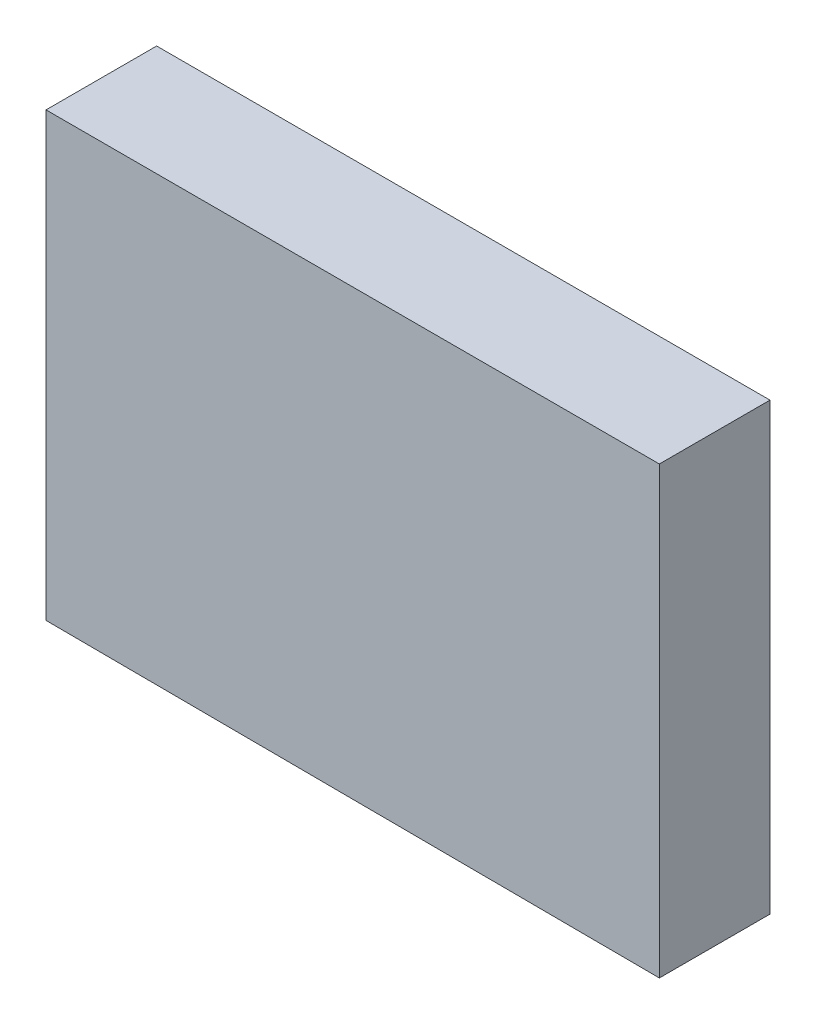
ISO-10303-21;
HEADER;
FILE_DESCRIPTION(('STEP AP214'),'2;1');
FILE_NAME('part.step','',(''),(''),'','','');
FILE_SCHEMA(('AUTOMOTIVE_DESIGN { 1 0 10303 214 1 1 1 1 }'));
ENDSEC;
DATA;
#1=APPLICATION_CONTEXT('core data for automotive mechanical design processes');
#2=APPLICATION_PROTOCOL_DEFINITION('international standard','automotive_design',2000,#1);
#3=PRODUCT_CONTEXT('',#1,'mechanical');
#4=PRODUCT('Part','Part','',(#3));
#5=PRODUCT_RELATED_PRODUCT_CATEGORY('part','',(#4));
#6=PRODUCT_DEFINITION_FORMATION('','',#4);
#7=PRODUCT_DEFINITION_CONTEXT('part definition',#1,'design');
#8=PRODUCT_DEFINITION('design','',#6,#7);
#9=PRODUCT_DEFINITION_SHAPE('','',#8);
#10=(LENGTH_UNIT() NAMED_UNIT(*) SI_UNIT(.MILLI.,.METRE.));
#11=(NAMED_UNIT(*) PLANE_ANGLE_UNIT() SI_UNIT($,.RADIAN.));
#12=(NAMED_UNIT(*) SI_UNIT($,.STERADIAN.) SOLID_ANGLE_UNIT());
#13=UNCERTAINTY_MEASURE_WITH_UNIT(LENGTH_MEASURE(1.E-05),#10,'distance_accuracy_value','');
#14=(GEOMETRIC_REPRESENTATION_CONTEXT(3) GLOBAL_UNCERTAINTY_ASSIGNED_CONTEXT((#13)) GLOBAL_UNIT_ASSIGNED_CONTEXT((#10,
#11,#12)) REPRESENTATION_CONTEXT('',''));
#15=CARTESIAN_POINT('',(0.,0.,0.));
#16=DIRECTION('',(0.,0.,1.));
#17=DIRECTION('',(1.,0.,0.));
#18=AXIS2_PLACEMENT_3D('',#15,#16,#17);
#19=CARTESIAN_POINT('',(3.32677262,-2.41461036,1.20000014));
#20=DIRECTION('',(0.,0.,-1.));
#21=DIRECTION('',(-1.,0.,0.));
#22=AXIS2_PLACEMENT_3D('',#19,#20,#21);
#23=PLANE('',#22);
#24=DIRECTION('',(1.,0.,0.));
#25=VECTOR('',#24,1.);
#26=CARTESIAN_POINT('',(3.32677262,2.4146129,1.20000014));
#27=LINE('',#26,#25);
#28=CARTESIAN_POINT('',(3.32677262,2.4146129,1.20000014));
#29=VERTEX_POINT('',#28);
#30=CARTESIAN_POINT('',(-3.32677008,2.4146129,1.20000014));
#31=VERTEX_POINT('',#30);
#32=EDGE_CURVE('E55',#29,#31,#27,.F.);
#33=ORIENTED_EDGE('',*,*,#32,.T.);
#34=DIRECTION('',(0.,1.,0.));
#35=VECTOR('',#34,1.);
#36=CARTESIAN_POINT('',(-3.32677008,2.4146129,1.20000014));
#37=LINE('',#36,#35);
#38=CARTESIAN_POINT('',(-3.32677008,-2.3822533,1.20000014));
#39=VERTEX_POINT('',#38);
#40=EDGE_CURVE('E57',#31,#39,#37,.F.);
#41=ORIENTED_EDGE('',*,*,#40,.T.);
#42=DIRECTION('',(-0.9999881751807,0.00486307503273354,0.));
#43=VECTOR('',#42,1.);
#44=CARTESIAN_POINT('',(-3.32677008,-2.3822533,1.20000014));
#45=LINE('',#44,#43);
#46=CARTESIAN_POINT('',(3.32677262,-2.41461035999999,1.20000014));
#47=VERTEX_POINT('',#46);
#48=EDGE_CURVE('E20',#39,#47,#45,.F.);
#49=ORIENTED_EDGE('',*,*,#48,.T.);
#50=DIRECTION('',(0.,1.,0.));
#51=VECTOR('',#50,1.);
#52=CARTESIAN_POINT('',(3.32677262,-2.41461036,1.20000014));
#53=LINE('',#52,#51);
#54=EDGE_CURVE('E80',#47,#29,#53,.T.);
#55=ORIENTED_EDGE('',*,*,#54,.T.);
#56=EDGE_LOOP('',(#33,#41,#49,#55));
#57=FACE_BOUND('',#56,.T.);
#58=ADVANCED_FACE('F17',(#57),#23,.F.);
#59=CARTESIAN_POINT('',(-3.32677008,-2.3822533,0.));
#60=DIRECTION('',(0.00486307503273354,0.9999881751807,0.));
#61=DIRECTION('',(-0.9999881751807,0.00486307503273354,0.));
#62=AXIS2_PLACEMENT_3D('',#59,#60,#61);
#63=PLANE('',#62);
#64=DIRECTION('',(0.,0.,1.));
#65=VECTOR('',#64,1.);
#66=CARTESIAN_POINT('',(3.32677262,-2.41461036,0.));
#67=LINE('',#66,#65);
#68=CARTESIAN_POINT('',(3.32677262,-2.41461035999999,0.));
#69=VERTEX_POINT('',#68);
#70=EDGE_CURVE('E68',#69,#47,#67,.T.);
#71=ORIENTED_EDGE('',*,*,#70,.T.);
#72=ORIENTED_EDGE('',*,*,#48,.F.);
#73=DIRECTION('',(0.,0.,-1.));
#74=VECTOR('',#73,1.);
#75=CARTESIAN_POINT('',(-3.32677008,-2.3822533,0.));
#76=LINE('',#75,#74);
#77=CARTESIAN_POINT('',(-3.32677008,-2.3822533,0.));
#78=VERTEX_POINT('',#77);
#79=EDGE_CURVE('E63',#39,#78,#76,.T.);
#80=ORIENTED_EDGE('',*,*,#79,.T.);
#81=DIRECTION('',(-0.9999881751807,0.00486307503273593,0.));
#82=VECTOR('',#81,1.);
#83=CARTESIAN_POINT('',(3.32677262,-2.41461036,0.));
#84=LINE('',#83,#82);
#85=EDGE_CURVE('E83',#69,#78,#84,.T.);
#86=ORIENTED_EDGE('',*,*,#85,.F.);
#87=EDGE_LOOP('',(#71,#72,#80,#86));
#88=FACE_BOUND('',#87,.T.);
#89=ADVANCED_FACE('F65',(#88),#63,.F.);
#90=CARTESIAN_POINT('',(-3.32677008,2.4146129,0.));
#91=DIRECTION('',(1.,0.,0.));
#92=DIRECTION('',(0.,0.,-1.));
#93=AXIS2_PLACEMENT_3D('',#90,#91,#92);
#94=PLANE('',#93);
#95=ORIENTED_EDGE('',*,*,#79,.F.);
#96=ORIENTED_EDGE('',*,*,#40,.F.);
#97=DIRECTION('',(0.,0.,-1.));
#98=VECTOR('',#97,1.);
#99=CARTESIAN_POINT('',(-3.32677008,2.4146129,0.));
#100=LINE('',#99,#98);
#101=CARTESIAN_POINT('',(-3.32677008,2.4146129,0.));
#102=VERTEX_POINT('',#101);
#103=EDGE_CURVE('E75',#31,#102,#100,.T.);
#104=ORIENTED_EDGE('',*,*,#103,.T.);
#105=DIRECTION('',(0.,1.,0.));
#106=VECTOR('',#105,1.);
#107=CARTESIAN_POINT('',(-3.32677008,-2.41461036,0.));
#108=LINE('',#107,#106);
#109=EDGE_CURVE('E72',#78,#102,#108,.T.);
#110=ORIENTED_EDGE('',*,*,#109,.F.);
#111=EDGE_LOOP('',(#95,#96,#104,#110));
#112=FACE_BOUND('',#111,.T.);
#113=ADVANCED_FACE('F70',(#112),#94,.F.);
#114=CARTESIAN_POINT('',(3.32677262,2.4146129,0.));
#115=DIRECTION('',(0.,-1.,0.));
#116=DIRECTION('',(0.,0.,-1.));
#117=AXIS2_PLACEMENT_3D('',#114,#115,#116);
#118=PLANE('',#117);
#119=ORIENTED_EDGE('',*,*,#103,.F.);
#120=ORIENTED_EDGE('',*,*,#32,.F.);
#121=DIRECTION('',(0.,0.,1.));
#122=VECTOR('',#121,1.);
#123=CARTESIAN_POINT('',(3.32677262,2.4146129,0.));
#124=LINE('',#123,#122);
#125=CARTESIAN_POINT('',(3.32677262,2.4146129,0.));
#126=VERTEX_POINT('',#125);
#127=EDGE_CURVE('E35',#29,#126,#124,.F.);
#128=ORIENTED_EDGE('',*,*,#127,.T.);
#129=DIRECTION('',(-1.,0.,0.));
#130=VECTOR('',#129,1.);
#131=CARTESIAN_POINT('',(3.32677262,2.4146129,0.));
#132=LINE('',#131,#130);
#133=EDGE_CURVE('E26',#102,#126,#132,.F.);
#134=ORIENTED_EDGE('',*,*,#133,.F.);
#135=EDGE_LOOP('',(#119,#120,#128,#134));
#136=FACE_BOUND('',#135,.T.);
#137=ADVANCED_FACE('F89',(#136),#118,.F.);
#138=CARTESIAN_POINT('',(3.32677262,-2.41461036,0.));
#139=DIRECTION('',(-1.,0.,0.));
#140=DIRECTION('',(0.,0.,1.));
#141=AXIS2_PLACEMENT_3D('',#138,#139,#140);
#142=PLANE('',#141);
#143=ORIENTED_EDGE('',*,*,#127,.F.);
#144=ORIENTED_EDGE('',*,*,#54,.F.);
#145=ORIENTED_EDGE('',*,*,#70,.F.);
#146=DIRECTION('',(0.,1.,0.));
#147=VECTOR('',#146,1.);
#148=CARTESIAN_POINT('',(3.32677262,-2.41461036,0.));
#149=LINE('',#148,#147);
#150=EDGE_CURVE('E11',#126,#69,#149,.F.);
#151=ORIENTED_EDGE('',*,*,#150,.F.);
#152=EDGE_LOOP('',(#143,#144,#145,#151));
#153=FACE_BOUND('',#152,.T.);
#154=ADVANCED_FACE('F91',(#153),#142,.F.);
#155=CARTESIAN_POINT('',(3.32677262,-2.41461036,0.));
#156=DIRECTION('',(0.,0.,-1.));
#157=DIRECTION('',(-1.,0.,0.));
#158=AXIS2_PLACEMENT_3D('',#155,#156,#157);
#159=PLANE('',#158);
#160=ORIENTED_EDGE('',*,*,#133,.T.);
#161=ORIENTED_EDGE('',*,*,#150,.T.);
#162=ORIENTED_EDGE('',*,*,#85,.T.);
#163=ORIENTED_EDGE('',*,*,#109,.T.);
#164=EDGE_LOOP('',(#160,#161,#162,#163));
#165=FACE_BOUND('',#164,.T.);
#166=ADVANCED_FACE('F88',(#165),#159,.T.);
#167=CLOSED_SHELL('',(#58,#89,#113,#137,#154,#166));
#168=MANIFOLD_SOLID_BREP('B1',#167);
#169=ADVANCED_BREP_SHAPE_REPRESENTATION('',(#18,#168),#14);
#170=SHAPE_DEFINITION_REPRESENTATION(#9,#169);
ENDSEC;
END-ISO-10303-21;
